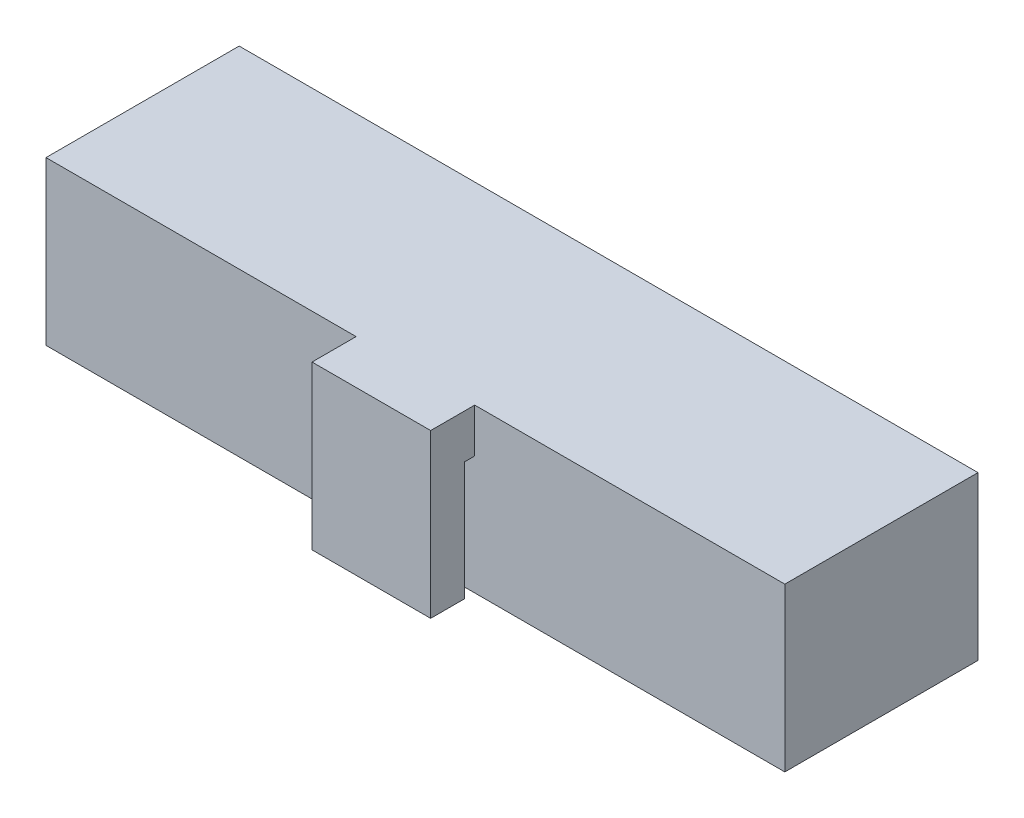
ISO-10303-21;
HEADER;
FILE_DESCRIPTION(('STEP AP214'),'2;1');
FILE_NAME('part.step','',(''),(''),'','','');
FILE_SCHEMA(('AUTOMOTIVE_DESIGN { 1 0 10303 214 1 1 1 1 }'));
ENDSEC;
DATA;
#1=APPLICATION_CONTEXT('core data for automotive mechanical design processes');
#2=APPLICATION_PROTOCOL_DEFINITION('international standard','automotive_design',2000,#1);
#3=PRODUCT_CONTEXT('',#1,'mechanical');
#4=PRODUCT('Part','Part','',(#3));
#5=PRODUCT_RELATED_PRODUCT_CATEGORY('part','',(#4));
#6=PRODUCT_DEFINITION_FORMATION('','',#4);
#7=PRODUCT_DEFINITION_CONTEXT('part definition',#1,'design');
#8=PRODUCT_DEFINITION('design','',#6,#7);
#9=PRODUCT_DEFINITION_SHAPE('','',#8);
#10=(LENGTH_UNIT() NAMED_UNIT(*) SI_UNIT(.MILLI.,.METRE.));
#11=(NAMED_UNIT(*) PLANE_ANGLE_UNIT() SI_UNIT($,.RADIAN.));
#12=(NAMED_UNIT(*) SI_UNIT($,.STERADIAN.) SOLID_ANGLE_UNIT());
#13=UNCERTAINTY_MEASURE_WITH_UNIT(LENGTH_MEASURE(1.E-05),#10,'distance_accuracy_value','');
#14=(GEOMETRIC_REPRESENTATION_CONTEXT(3) GLOBAL_UNCERTAINTY_ASSIGNED_CONTEXT((#13)) GLOBAL_UNIT_ASSIGNED_CONTEXT((#10,
#11,#12)) REPRESENTATION_CONTEXT('',''));
#15=CARTESIAN_POINT('',(0.,0.,0.));
#16=DIRECTION('',(0.,0.,1.));
#17=DIRECTION('',(1.,0.,0.));
#18=AXIS2_PLACEMENT_3D('',#15,#16,#17);
#19=CARTESIAN_POINT('',(-10.9,-2.4,7.));
#20=DIRECTION('',(0.,1.,0.));
#21=DIRECTION('',(0.,0.,1.));
#22=AXIS2_PLACEMENT_3D('',#19,#20,#21);
#23=PLANE('',#22);
#24=DIRECTION('',(0.,0.,-1.));
#25=VECTOR('',#24,1.);
#26=CARTESIAN_POINT('',(10.9,-2.4,7.));
#27=LINE('',#26,#25);
#28=CARTESIAN_POINT('',(10.9,-2.4,5.7));
#29=VERTEX_POINT('',#28);
#30=CARTESIAN_POINT('',(10.9,-2.4,0.));
#31=VERTEX_POINT('',#30);
#32=EDGE_CURVE('E176',#29,#31,#27,.T.);
#33=ORIENTED_EDGE('',*,*,#32,.F.);
#34=DIRECTION('',(1.,0.,0.));
#35=VECTOR('',#34,1.);
#36=CARTESIAN_POINT('',(-10.9,-2.4,5.7));
#37=LINE('',#36,#35);
#38=CARTESIAN_POINT('',(-10.9,-2.4,5.7));
#39=VERTEX_POINT('',#38);
#40=EDGE_CURVE('E145',#39,#29,#37,.T.);
#41=ORIENTED_EDGE('',*,*,#40,.F.);
#42=DIRECTION('',(0.,0.,-1.));
#43=VECTOR('',#42,1.);
#44=CARTESIAN_POINT('',(-10.9,-2.4,7.));
#45=LINE('',#44,#43);
#46=CARTESIAN_POINT('',(-10.9,-2.4,0.));
#47=VERTEX_POINT('',#46);
#48=EDGE_CURVE('E188',#39,#47,#45,.T.);
#49=ORIENTED_EDGE('',*,*,#48,.T.);
#50=DIRECTION('',(1.,0.,0.));
#51=VECTOR('',#50,1.);
#52=CARTESIAN_POINT('',(-10.9,-2.4,0.));
#53=LINE('',#52,#51);
#54=EDGE_CURVE('E173',#47,#31,#53,.T.);
#55=ORIENTED_EDGE('',*,*,#54,.T.);
#56=EDGE_LOOP('',(#33,#41,#49,#55));
#57=FACE_BOUND('',#56,.T.);
#58=ADVANCED_FACE('F39',(#57),#23,.F.);
#59=CARTESIAN_POINT('',(-10.9,2.4,7.));
#60=DIRECTION('',(0.,-1.,0.));
#61=DIRECTION('',(0.,0.,-1.));
#62=AXIS2_PLACEMENT_3D('',#59,#60,#61);
#63=PLANE('',#62);
#64=DIRECTION('',(1.,0.,0.));
#65=VECTOR('',#64,1.);
#66=CARTESIAN_POINT('',(-10.9,2.4,5.7));
#67=LINE('',#66,#65);
#68=CARTESIAN_POINT('',(-10.9,2.4,5.7));
#69=VERTEX_POINT('',#68);
#70=CARTESIAN_POINT('',(-1.75,2.4,5.7));
#71=VERTEX_POINT('',#70);
#72=EDGE_CURVE('E140',#69,#71,#67,.T.);
#73=ORIENTED_EDGE('',*,*,#72,.T.);
#74=DIRECTION('',(0.,0.,1.));
#75=VECTOR('',#74,1.);
#76=CARTESIAN_POINT('',(-1.75,2.4,5.7));
#77=LINE('',#76,#75);
#78=CARTESIAN_POINT('',(-1.75,2.4,7.));
#79=VERTEX_POINT('',#78);
#80=EDGE_CURVE('E153',#71,#79,#77,.T.);
#81=ORIENTED_EDGE('',*,*,#80,.T.);
#82=DIRECTION('',(-1.,0.,0.));
#83=VECTOR('',#82,1.);
#84=CARTESIAN_POINT('',(-10.9,2.4,7.));
#85=LINE('',#84,#83);
#86=CARTESIAN_POINT('',(1.75,2.4,7.));
#87=VERTEX_POINT('',#86);
#88=EDGE_CURVE('E169',#87,#79,#85,.T.);
#89=ORIENTED_EDGE('',*,*,#88,.F.);
#90=DIRECTION('',(0.,0.,1.));
#91=VECTOR('',#90,1.);
#92=CARTESIAN_POINT('',(1.75,2.4,5.7));
#93=LINE('',#92,#91);
#94=CARTESIAN_POINT('',(1.75,2.4,5.7));
#95=VERTEX_POINT('',#94);
#96=EDGE_CURVE('E157',#95,#87,#93,.T.);
#97=ORIENTED_EDGE('',*,*,#96,.F.);
#98=DIRECTION('',(-1.,0.,0.));
#99=VECTOR('',#98,1.);
#100=CARTESIAN_POINT('',(10.9,2.4,5.7));
#101=LINE('',#100,#99);
#102=CARTESIAN_POINT('',(10.9,2.4,5.7));
#103=VERTEX_POINT('',#102);
#104=EDGE_CURVE('E163',#103,#95,#101,.T.);
#105=ORIENTED_EDGE('',*,*,#104,.F.);
#106=DIRECTION('',(0.,0.,-1.));
#107=VECTOR('',#106,1.);
#108=CARTESIAN_POINT('',(10.9,2.4,7.));
#109=LINE('',#108,#107);
#110=CARTESIAN_POINT('',(10.9,2.4,0.));
#111=VERTEX_POINT('',#110);
#112=EDGE_CURVE('E11',#103,#111,#109,.T.);
#113=ORIENTED_EDGE('',*,*,#112,.T.);
#114=DIRECTION('',(-1.,0.,0.));
#115=VECTOR('',#114,1.);
#116=CARTESIAN_POINT('',(-10.9,2.4,0.));
#117=LINE('',#116,#115);
#118=CARTESIAN_POINT('',(-10.9,2.4,0.));
#119=VERTEX_POINT('',#118);
#120=EDGE_CURVE('E179',#111,#119,#117,.T.);
#121=ORIENTED_EDGE('',*,*,#120,.T.);
#122=DIRECTION('',(0.,0.,-1.));
#123=VECTOR('',#122,1.);
#124=CARTESIAN_POINT('',(-10.9,2.4,7.));
#125=LINE('',#124,#123);
#126=EDGE_CURVE('E47',#69,#119,#125,.T.);
#127=ORIENTED_EDGE('',*,*,#126,.F.);
#128=EDGE_LOOP('',(#73,#81,#89,#97,#105,#113,#121,#127));
#129=FACE_BOUND('',#128,.T.);
#130=ADVANCED_FACE('F197',(#129),#63,.F.);
#131=CARTESIAN_POINT('',(-10.9,-2.4,7.));
#132=DIRECTION('',(1.,0.,0.));
#133=DIRECTION('',(0.,0.,-1.));
#134=AXIS2_PLACEMENT_3D('',#131,#132,#133);
#135=PLANE('',#134);
#136=DIRECTION('',(0.,1.,0.));
#137=VECTOR('',#136,1.);
#138=CARTESIAN_POINT('',(-10.9,-2.4,5.7));
#139=LINE('',#138,#137);
#140=EDGE_CURVE('E147',#39,#69,#139,.T.);
#141=ORIENTED_EDGE('',*,*,#140,.T.);
#142=ORIENTED_EDGE('',*,*,#126,.T.);
#143=DIRECTION('',(0.,-1.,0.));
#144=VECTOR('',#143,1.);
#145=CARTESIAN_POINT('',(-10.9,-2.4,0.));
#146=LINE('',#145,#144);
#147=EDGE_CURVE('E182',#119,#47,#146,.T.);
#148=ORIENTED_EDGE('',*,*,#147,.T.);
#149=ORIENTED_EDGE('',*,*,#48,.F.);
#150=EDGE_LOOP('',(#141,#142,#148,#149));
#151=FACE_BOUND('',#150,.T.);
#152=ADVANCED_FACE('F191',(#151),#135,.F.);
#153=DIRECTION('',(0.,0.,1.));
#154=VECTOR('',#153,1.);
#155=CARTESIAN_POINT('',(-1.75,-2.4,5.7));
#156=LINE('',#155,#154);
#157=CARTESIAN_POINT('',(-1.75,-2.4,6.));
#158=VERTEX_POINT('',#157);
#159=CARTESIAN_POINT('',(-1.75,-2.4,7.));
#160=VERTEX_POINT('',#159);
#161=EDGE_CURVE('E62',#158,#160,#156,.T.);
#162=ORIENTED_EDGE('',*,*,#161,.F.);
#163=DIRECTION('',(-1.,0.,0.));
#164=VECTOR('',#163,1.);
#165=CARTESIAN_POINT('',(1.75,-2.4,6.));
#166=LINE('',#165,#164);
#167=CARTESIAN_POINT('',(1.75,-2.4,6.));
#168=VERTEX_POINT('',#167);
#169=EDGE_CURVE('E120',#168,#158,#166,.T.);
#170=ORIENTED_EDGE('',*,*,#169,.F.);
#171=DIRECTION('',(0.,0.,1.));
#172=VECTOR('',#171,1.);
#173=CARTESIAN_POINT('',(1.75,-2.4,5.7));
#174=LINE('',#173,#172);
#175=CARTESIAN_POINT('',(1.75,-2.4,7.));
#176=VERTEX_POINT('',#175);
#177=EDGE_CURVE('E138',#168,#176,#174,.T.);
#178=ORIENTED_EDGE('',*,*,#177,.T.);
#179=DIRECTION('',(1.,0.,0.));
#180=VECTOR('',#179,1.);
#181=CARTESIAN_POINT('',(-10.9,-2.4,7.));
#182=LINE('',#181,#180);
#183=EDGE_CURVE('E172',#160,#176,#182,.T.);
#184=ORIENTED_EDGE('',*,*,#183,.F.);
#185=EDGE_LOOP('',(#162,#170,#178,#184));
#186=FACE_BOUND('',#185,.T.);
#187=ADVANCED_FACE('F219',(#186),#23,.F.);
#188=CARTESIAN_POINT('',(0.,0.,7.));
#189=DIRECTION('',(0.,0.,-1.));
#190=DIRECTION('',(-1.,0.,0.));
#191=AXIS2_PLACEMENT_3D('',#188,#189,#190);
#192=PLANE('',#191);
#193=ORIENTED_EDGE('',*,*,#88,.T.);
#194=DIRECTION('',(0.,1.,0.));
#195=VECTOR('',#194,1.);
#196=CARTESIAN_POINT('',(-1.75,-2.4,7.));
#197=LINE('',#196,#195);
#198=EDGE_CURVE('E143',#160,#79,#197,.T.);
#199=ORIENTED_EDGE('',*,*,#198,.F.);
#200=ORIENTED_EDGE('',*,*,#183,.T.);
#201=DIRECTION('',(0.,1.,0.));
#202=VECTOR('',#201,1.);
#203=CARTESIAN_POINT('',(1.75,-2.4,7.));
#204=LINE('',#203,#202);
#205=EDGE_CURVE('E151',#176,#87,#204,.T.);
#206=ORIENTED_EDGE('',*,*,#205,.T.);
#207=EDGE_LOOP('',(#193,#199,#200,#206));
#208=FACE_BOUND('',#207,.T.);
#209=ADVANCED_FACE('F211',(#208),#192,.F.);
#210=CARTESIAN_POINT('',(10.9,-2.4,7.));
#211=DIRECTION('',(-1.,0.,0.));
#212=DIRECTION('',(0.,0.,1.));
#213=AXIS2_PLACEMENT_3D('',#210,#211,#212);
#214=PLANE('',#213);
#215=ORIENTED_EDGE('',*,*,#112,.F.);
#216=DIRECTION('',(0.,1.,0.));
#217=VECTOR('',#216,1.);
#218=CARTESIAN_POINT('',(10.9,-2.4,5.7));
#219=LINE('',#218,#217);
#220=EDGE_CURVE('E159',#29,#103,#219,.T.);
#221=ORIENTED_EDGE('',*,*,#220,.F.);
#222=ORIENTED_EDGE('',*,*,#32,.T.);
#223=DIRECTION('',(0.,1.,0.));
#224=VECTOR('',#223,1.);
#225=CARTESIAN_POINT('',(10.9,-2.4,0.));
#226=LINE('',#225,#224);
#227=EDGE_CURVE('E156',#31,#111,#226,.T.);
#228=ORIENTED_EDGE('',*,*,#227,.T.);
#229=EDGE_LOOP('',(#215,#221,#222,#228));
#230=FACE_BOUND('',#229,.T.);
#231=ADVANCED_FACE('F41',(#230),#214,.F.);
#232=CARTESIAN_POINT('',(0.,0.,0.));
#233=DIRECTION('',(0.,0.,-1.));
#234=DIRECTION('',(-1.,0.,0.));
#235=AXIS2_PLACEMENT_3D('',#232,#233,#234);
#236=PLANE('',#235);
#237=ORIENTED_EDGE('',*,*,#227,.F.);
#238=ORIENTED_EDGE('',*,*,#54,.F.);
#239=ORIENTED_EDGE('',*,*,#147,.F.);
#240=ORIENTED_EDGE('',*,*,#120,.F.);
#241=EDGE_LOOP('',(#237,#238,#239,#240));
#242=FACE_BOUND('',#241,.T.);
#243=ADVANCED_FACE('F202',(#242),#236,.T.);
#244=CARTESIAN_POINT('',(1.75,-2.4,5.7));
#245=DIRECTION('',(1.,0.,0.));
#246=DIRECTION('',(0.,0.,-1.));
#247=AXIS2_PLACEMENT_3D('',#244,#245,#246);
#248=PLANE('',#247);
#249=DIRECTION('',(0.,-1.,0.));
#250=VECTOR('',#249,1.);
#251=CARTESIAN_POINT('',(1.75,1.1,6.));
#252=LINE('',#251,#250);
#253=CARTESIAN_POINT('',(1.75,1.1,6.));
#254=VERTEX_POINT('',#253);
#255=EDGE_CURVE('E121',#254,#168,#252,.T.);
#256=ORIENTED_EDGE('',*,*,#255,.F.);
#257=DIRECTION('',(0.,0.,1.));
#258=VECTOR('',#257,1.);
#259=CARTESIAN_POINT('',(1.75,1.1,5.7));
#260=LINE('',#259,#258);
#261=CARTESIAN_POINT('',(1.75,1.1,5.7));
#262=VERTEX_POINT('',#261);
#263=EDGE_CURVE('E122',#262,#254,#260,.T.);
#264=ORIENTED_EDGE('',*,*,#263,.F.);
#265=DIRECTION('',(0.,1.,0.));
#266=VECTOR('',#265,1.);
#267=CARTESIAN_POINT('',(1.75,-2.4,5.7));
#268=LINE('',#267,#266);
#269=EDGE_CURVE('E165',#262,#95,#268,.T.);
#270=ORIENTED_EDGE('',*,*,#269,.T.);
#271=ORIENTED_EDGE('',*,*,#96,.T.);
#272=ORIENTED_EDGE('',*,*,#205,.F.);
#273=ORIENTED_EDGE('',*,*,#177,.F.);
#274=EDGE_LOOP('',(#256,#264,#270,#271,#272,#273));
#275=FACE_BOUND('',#274,.T.);
#276=ADVANCED_FACE('F217',(#275),#248,.T.);
#277=CARTESIAN_POINT('',(-1.75,-2.4,5.7));
#278=DIRECTION('',(1.,0.,0.));
#279=DIRECTION('',(0.,0.,-1.));
#280=AXIS2_PLACEMENT_3D('',#277,#278,#279);
#281=PLANE('',#280);
#282=DIRECTION('',(0.,0.,1.));
#283=VECTOR('',#282,1.);
#284=CARTESIAN_POINT('',(-1.75,1.1,5.7));
#285=LINE('',#284,#283);
#286=CARTESIAN_POINT('',(-1.75,1.1,5.7));
#287=VERTEX_POINT('',#286);
#288=CARTESIAN_POINT('',(-1.75,1.1,6.));
#289=VERTEX_POINT('',#288);
#290=EDGE_CURVE('E54',#287,#289,#285,.T.);
#291=ORIENTED_EDGE('',*,*,#290,.T.);
#292=DIRECTION('',(0.,-1.,0.));
#293=VECTOR('',#292,1.);
#294=CARTESIAN_POINT('',(-1.75,1.1,6.));
#295=LINE('',#294,#293);
#296=EDGE_CURVE('E115',#289,#158,#295,.T.);
#297=ORIENTED_EDGE('',*,*,#296,.T.);
#298=ORIENTED_EDGE('',*,*,#161,.T.);
#299=ORIENTED_EDGE('',*,*,#198,.T.);
#300=ORIENTED_EDGE('',*,*,#80,.F.);
#301=DIRECTION('',(0.,1.,0.));
#302=VECTOR('',#301,1.);
#303=CARTESIAN_POINT('',(-1.75,-2.4,5.7));
#304=LINE('',#303,#302);
#305=EDGE_CURVE('E131',#287,#71,#304,.T.);
#306=ORIENTED_EDGE('',*,*,#305,.F.);
#307=EDGE_LOOP('',(#291,#297,#298,#299,#300,#306));
#308=FACE_BOUND('',#307,.T.);
#309=ADVANCED_FACE('F129',(#308),#281,.F.);
#310=CARTESIAN_POINT('',(0.,0.,5.7));
#311=DIRECTION('',(0.,0.,1.));
#312=DIRECTION('',(1.,0.,0.));
#313=AXIS2_PLACEMENT_3D('',#310,#311,#312);
#314=PLANE('',#313);
#315=ORIENTED_EDGE('',*,*,#72,.F.);
#316=ORIENTED_EDGE('',*,*,#140,.F.);
#317=ORIENTED_EDGE('',*,*,#40,.T.);
#318=ORIENTED_EDGE('',*,*,#220,.T.);
#319=ORIENTED_EDGE('',*,*,#104,.T.);
#320=ORIENTED_EDGE('',*,*,#269,.F.);
#321=DIRECTION('',(-1.,0.,0.));
#322=VECTOR('',#321,1.);
#323=CARTESIAN_POINT('',(1.75,1.1,5.7));
#324=LINE('',#323,#322);
#325=EDGE_CURVE('E132',#262,#287,#324,.T.);
#326=ORIENTED_EDGE('',*,*,#325,.T.);
#327=ORIENTED_EDGE('',*,*,#305,.T.);
#328=EDGE_LOOP('',(#315,#316,#317,#318,#319,#320,#326,#327));
#329=FACE_BOUND('',#328,.T.);
#330=ADVANCED_FACE('F208',(#329),#314,.T.);
#331=CARTESIAN_POINT('',(1.75,1.1,6.));
#332=DIRECTION('',(0.,0.,1.));
#333=DIRECTION('',(1.,0.,0.));
#334=AXIS2_PLACEMENT_3D('',#331,#332,#333);
#335=PLANE('',#334);
#336=ORIENTED_EDGE('',*,*,#169,.T.);
#337=ORIENTED_EDGE('',*,*,#296,.F.);
#338=DIRECTION('',(-1.,0.,0.));
#339=VECTOR('',#338,1.);
#340=CARTESIAN_POINT('',(1.75,1.1,6.));
#341=LINE('',#340,#339);
#342=EDGE_CURVE('E117',#254,#289,#341,.T.);
#343=ORIENTED_EDGE('',*,*,#342,.F.);
#344=ORIENTED_EDGE('',*,*,#255,.T.);
#345=EDGE_LOOP('',(#336,#337,#343,#344));
#346=FACE_BOUND('',#345,.T.);
#347=ADVANCED_FACE('F116',(#346),#335,.F.);
#348=CARTESIAN_POINT('',(0.,1.1,0.));
#349=DIRECTION('',(0.,1.,0.));
#350=DIRECTION('',(0.,0.,1.));
#351=AXIS2_PLACEMENT_3D('',#348,#349,#350);
#352=PLANE('',#351);
#353=ORIENTED_EDGE('',*,*,#342,.T.);
#354=ORIENTED_EDGE('',*,*,#290,.F.);
#355=ORIENTED_EDGE('',*,*,#325,.F.);
#356=ORIENTED_EDGE('',*,*,#263,.T.);
#357=EDGE_LOOP('',(#353,#354,#355,#356));
#358=FACE_BOUND('',#357,.T.);
#359=ADVANCED_FACE('F124',(#358),#352,.F.);
#360=CLOSED_SHELL('',(#58,#130,#152,#187,#209,#231,#243,#276,#309,#330,#347,#359));
#361=MANIFOLD_SOLID_BREP('B2',#360);
#362=ADVANCED_BREP_SHAPE_REPRESENTATION('',(#18,#361),#14);
#363=SHAPE_DEFINITION_REPRESENTATION(#9,#362);
ENDSEC;
END-ISO-10303-21;
